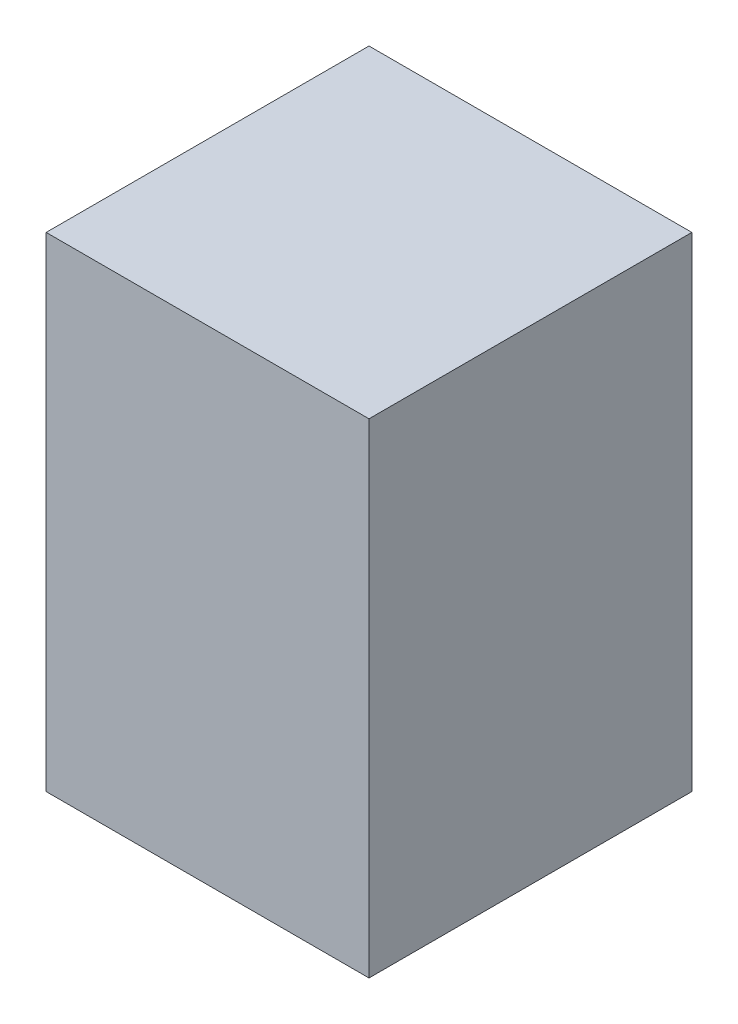
ISO-10303-21;
HEADER;
FILE_DESCRIPTION(('STEP AP214'),'2;1');
FILE_NAME('part.step','',(''),(''),'','','');
FILE_SCHEMA(('AUTOMOTIVE_DESIGN { 1 0 10303 214 1 1 1 1 }'));
ENDSEC;
DATA;
#1=APPLICATION_CONTEXT('core data for automotive mechanical design processes');
#2=APPLICATION_PROTOCOL_DEFINITION('international standard','automotive_design',2000,#1);
#3=PRODUCT_CONTEXT('',#1,'mechanical');
#4=PRODUCT('Part','Part','',(#3));
#5=PRODUCT_RELATED_PRODUCT_CATEGORY('part','',(#4));
#6=PRODUCT_DEFINITION_FORMATION('','',#4);
#7=PRODUCT_DEFINITION_CONTEXT('part definition',#1,'design');
#8=PRODUCT_DEFINITION('design','',#6,#7);
#9=PRODUCT_DEFINITION_SHAPE('','',#8);
#10=(LENGTH_UNIT() NAMED_UNIT(*) SI_UNIT(.MILLI.,.METRE.));
#11=(NAMED_UNIT(*) PLANE_ANGLE_UNIT() SI_UNIT($,.RADIAN.));
#12=(NAMED_UNIT(*) SI_UNIT($,.STERADIAN.) SOLID_ANGLE_UNIT());
#13=UNCERTAINTY_MEASURE_WITH_UNIT(LENGTH_MEASURE(1.E-05),#10,'distance_accuracy_value','');
#14=(GEOMETRIC_REPRESENTATION_CONTEXT(3) GLOBAL_UNCERTAINTY_ASSIGNED_CONTEXT((#13)) GLOBAL_UNIT_ASSIGNED_CONTEXT((#10,
#11,#12)) REPRESENTATION_CONTEXT('',''));
#15=CARTESIAN_POINT('',(0.,0.,0.));
#16=DIRECTION('',(0.,0.,1.));
#17=DIRECTION('',(1.,0.,0.));
#18=AXIS2_PLACEMENT_3D('',#15,#16,#17);
#19=CARTESIAN_POINT('',(560.,0.,-760.));
#20=DIRECTION('',(-1.,0.,0.));
#21=DIRECTION('',(0.,0.,1.));
#22=AXIS2_PLACEMENT_3D('',#19,#20,#21);
#23=PLANE('',#22);
#24=DIRECTION('',(0.,-1.,0.));
#25=VECTOR('',#24,1.);
#26=CARTESIAN_POINT('',(560.,0.,-680.));
#27=LINE('',#26,#25);
#28=CARTESIAN_POINT('',(560.,120.,-680.));
#29=VERTEX_POINT('',#28);
#30=CARTESIAN_POINT('',(560.,0.,-680.));
#31=VERTEX_POINT('',#30);
#32=EDGE_CURVE('E103',#29,#31,#27,.T.);
#33=ORIENTED_EDGE('',*,*,#32,.F.);
#34=DIRECTION('',(0.,0.,1.));
#35=VECTOR('',#34,1.);
#36=CARTESIAN_POINT('',(560.,120.,-760.));
#37=LINE('',#36,#35);
#38=CARTESIAN_POINT('',(560.,120.,-760.));
#39=VERTEX_POINT('',#38);
#40=EDGE_CURVE('E11',#39,#29,#37,.T.);
#41=ORIENTED_EDGE('',*,*,#40,.F.);
#42=DIRECTION('',(0.,-1.,0.));
#43=VECTOR('',#42,1.);
#44=CARTESIAN_POINT('',(560.,0.,-760.));
#45=LINE('',#44,#43);
#46=CARTESIAN_POINT('',(560.,0.,-760.));
#47=VERTEX_POINT('',#46);
#48=EDGE_CURVE('E97',#39,#47,#45,.T.);
#49=ORIENTED_EDGE('',*,*,#48,.T.);
#50=DIRECTION('',(0.,0.,1.));
#51=VECTOR('',#50,1.);
#52=CARTESIAN_POINT('',(560.,0.,-760.));
#53=LINE('',#52,#51);
#54=EDGE_CURVE('E42',#47,#31,#53,.T.);
#55=ORIENTED_EDGE('',*,*,#54,.T.);
#56=EDGE_LOOP('',(#33,#41,#49,#55));
#57=FACE_BOUND('',#56,.T.);
#58=ADVANCED_FACE('F39',(#57),#23,.T.);
#59=CARTESIAN_POINT('',(560.,120.,-760.));
#60=DIRECTION('',(0.,1.,0.));
#61=DIRECTION('',(0.,0.,1.));
#62=AXIS2_PLACEMENT_3D('',#59,#60,#61);
#63=PLANE('',#62);
#64=DIRECTION('',(-1.,0.,0.));
#65=VECTOR('',#64,1.);
#66=CARTESIAN_POINT('',(560.,120.,-680.));
#67=LINE('',#66,#65);
#68=CARTESIAN_POINT('',(640.,120.,-680.));
#69=VERTEX_POINT('',#68);
#70=EDGE_CURVE('E99',#69,#29,#67,.T.);
#71=ORIENTED_EDGE('',*,*,#70,.F.);
#72=DIRECTION('',(0.,0.,1.));
#73=VECTOR('',#72,1.);
#74=CARTESIAN_POINT('',(640.,120.,-760.));
#75=LINE('',#74,#73);
#76=CARTESIAN_POINT('',(640.,120.,-760.));
#77=VERTEX_POINT('',#76);
#78=EDGE_CURVE('E48',#77,#69,#75,.T.);
#79=ORIENTED_EDGE('',*,*,#78,.F.);
#80=DIRECTION('',(-1.,0.,0.));
#81=VECTOR('',#80,1.);
#82=CARTESIAN_POINT('',(560.,120.,-760.));
#83=LINE('',#82,#81);
#84=EDGE_CURVE('E94',#77,#39,#83,.T.);
#85=ORIENTED_EDGE('',*,*,#84,.T.);
#86=ORIENTED_EDGE('',*,*,#40,.T.);
#87=EDGE_LOOP('',(#71,#79,#85,#86));
#88=FACE_BOUND('',#87,.T.);
#89=ADVANCED_FACE('F113',(#88),#63,.T.);
#90=CARTESIAN_POINT('',(640.,0.,-760.));
#91=DIRECTION('',(1.,0.,0.));
#92=DIRECTION('',(0.,0.,-1.));
#93=AXIS2_PLACEMENT_3D('',#90,#91,#92);
#94=PLANE('',#93);
#95=DIRECTION('',(0.,1.,0.));
#96=VECTOR('',#95,1.);
#97=CARTESIAN_POINT('',(640.,0.,-680.));
#98=LINE('',#97,#96);
#99=CARTESIAN_POINT('',(640.,0.,-680.));
#100=VERTEX_POINT('',#99);
#101=EDGE_CURVE('E89',#100,#69,#98,.T.);
#102=ORIENTED_EDGE('',*,*,#101,.F.);
#103=DIRECTION('',(0.,0.,1.));
#104=VECTOR('',#103,1.);
#105=CARTESIAN_POINT('',(640.,0.,-760.));
#106=LINE('',#105,#104);
#107=CARTESIAN_POINT('',(640.,0.,-760.));
#108=VERTEX_POINT('',#107);
#109=EDGE_CURVE('E84',#108,#100,#106,.T.);
#110=ORIENTED_EDGE('',*,*,#109,.F.);
#111=DIRECTION('',(0.,1.,0.));
#112=VECTOR('',#111,1.);
#113=CARTESIAN_POINT('',(640.,0.,-760.));
#114=LINE('',#113,#112);
#115=EDGE_CURVE('E87',#108,#77,#114,.T.);
#116=ORIENTED_EDGE('',*,*,#115,.T.);
#117=ORIENTED_EDGE('',*,*,#78,.T.);
#118=EDGE_LOOP('',(#102,#110,#116,#117));
#119=FACE_BOUND('',#118,.T.);
#120=ADVANCED_FACE('F86',(#119),#94,.T.);
#121=CARTESIAN_POINT('',(560.,0.,-760.));
#122=DIRECTION('',(0.,-1.,0.));
#123=DIRECTION('',(0.,0.,-1.));
#124=AXIS2_PLACEMENT_3D('',#121,#122,#123);
#125=PLANE('',#124);
#126=DIRECTION('',(1.,0.,0.));
#127=VECTOR('',#126,1.);
#128=CARTESIAN_POINT('',(560.,0.,-680.));
#129=LINE('',#128,#127);
#130=EDGE_CURVE('E106',#31,#100,#129,.T.);
#131=ORIENTED_EDGE('',*,*,#130,.F.);
#132=ORIENTED_EDGE('',*,*,#54,.F.);
#133=DIRECTION('',(1.,0.,0.));
#134=VECTOR('',#133,1.);
#135=CARTESIAN_POINT('',(560.,0.,-760.));
#136=LINE('',#135,#134);
#137=EDGE_CURVE('E93',#47,#108,#136,.T.);
#138=ORIENTED_EDGE('',*,*,#137,.T.);
#139=ORIENTED_EDGE('',*,*,#109,.T.);
#140=EDGE_LOOP('',(#131,#132,#138,#139));
#141=FACE_BOUND('',#140,.T.);
#142=ADVANCED_FACE('F96',(#141),#125,.T.);
#143=CARTESIAN_POINT('',(0.,0.,-760.));
#144=DIRECTION('',(0.,0.,-1.));
#145=DIRECTION('',(-1.,0.,0.));
#146=AXIS2_PLACEMENT_3D('',#143,#144,#145);
#147=PLANE('',#146);
#148=ORIENTED_EDGE('',*,*,#48,.F.);
#149=ORIENTED_EDGE('',*,*,#84,.F.);
#150=ORIENTED_EDGE('',*,*,#115,.F.);
#151=ORIENTED_EDGE('',*,*,#137,.F.);
#152=EDGE_LOOP('',(#148,#149,#150,#151));
#153=FACE_BOUND('',#152,.T.);
#154=ADVANCED_FACE('F92',(#153),#147,.T.);
#155=CARTESIAN_POINT('',(0.,0.,-680.));
#156=DIRECTION('',(0.,0.,-1.));
#157=DIRECTION('',(-1.,0.,0.));
#158=AXIS2_PLACEMENT_3D('',#155,#156,#157);
#159=PLANE('',#158);
#160=ORIENTED_EDGE('',*,*,#32,.T.);
#161=ORIENTED_EDGE('',*,*,#130,.T.);
#162=ORIENTED_EDGE('',*,*,#101,.T.);
#163=ORIENTED_EDGE('',*,*,#70,.T.);
#164=EDGE_LOOP('',(#160,#161,#162,#163));
#165=FACE_BOUND('',#164,.T.);
#166=ADVANCED_FACE('F112',(#165),#159,.F.);
#167=CLOSED_SHELL('',(#58,#89,#120,#142,#154,#166));
#168=MANIFOLD_SOLID_BREP('B2',#167);
#169=ADVANCED_BREP_SHAPE_REPRESENTATION('',(#18,#168),#14);
#170=SHAPE_DEFINITION_REPRESENTATION(#9,#169);
ENDSEC;
END-ISO-10303-21;
